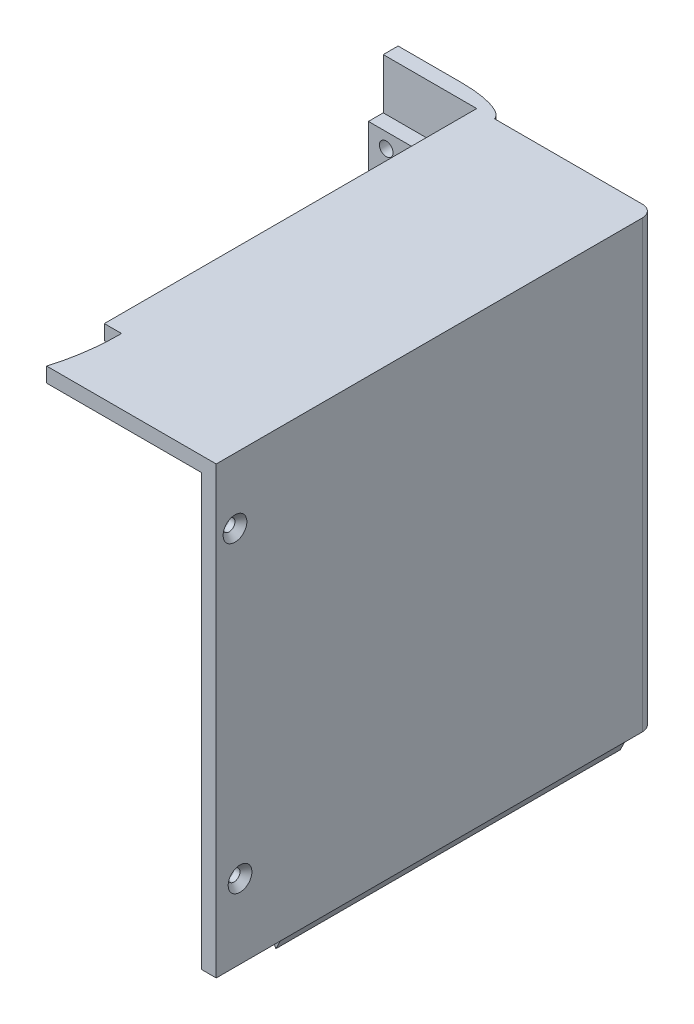
ISO-10303-21;
HEADER;
FILE_DESCRIPTION(('STEP AP214'),'2;1');
FILE_NAME('part.step','',(''),(''),'','','');
FILE_SCHEMA(('AUTOMOTIVE_DESIGN { 1 0 10303 214 1 1 1 1 }'));
ENDSEC;
DATA;
#1=APPLICATION_CONTEXT('core data for automotive mechanical design processes');
#2=APPLICATION_PROTOCOL_DEFINITION('international standard','automotive_design',2000,#1);
#3=PRODUCT_CONTEXT('',#1,'mechanical');
#4=PRODUCT('Part','Part','',(#3));
#5=PRODUCT_RELATED_PRODUCT_CATEGORY('part','',(#4));
#6=PRODUCT_DEFINITION_FORMATION('','',#4);
#7=PRODUCT_DEFINITION_CONTEXT('part definition',#1,'design');
#8=PRODUCT_DEFINITION('design','',#6,#7);
#9=PRODUCT_DEFINITION_SHAPE('','',#8);
#10=(LENGTH_UNIT() NAMED_UNIT(*) SI_UNIT(.MILLI.,.METRE.));
#11=(NAMED_UNIT(*) PLANE_ANGLE_UNIT() SI_UNIT($,.RADIAN.));
#12=(NAMED_UNIT(*) SI_UNIT($,.STERADIAN.) SOLID_ANGLE_UNIT());
#13=UNCERTAINTY_MEASURE_WITH_UNIT(LENGTH_MEASURE(1.E-05),#10,'distance_accuracy_value','');
#14=(GEOMETRIC_REPRESENTATION_CONTEXT(3) GLOBAL_UNCERTAINTY_ASSIGNED_CONTEXT((#13)) GLOBAL_UNIT_ASSIGNED_CONTEXT((#10,
#11,#12)) REPRESENTATION_CONTEXT('',''));
#15=CARTESIAN_POINT('',(0.,0.,0.));
#16=DIRECTION('',(0.,0.,1.));
#17=DIRECTION('',(1.,0.,0.));
#18=AXIS2_PLACEMENT_3D('',#15,#16,#17);
#19=CARTESIAN_POINT('',(0.,75.,-18.3333333333334));
#20=DIRECTION('',(0.,0.,-1.));
#21=DIRECTION('',(-1.,0.,0.));
#22=AXIS2_PLACEMENT_3D('',#19,#20,#21);
#23=PLANE('',#22);
#24=CARTESIAN_POINT('',(-61.9495064540623,11.,-18.3333333333334));
#25=DIRECTION('',(0.,0.,-1.));
#26=DIRECTION('',(-1.,0.,0.));
#27=AXIS2_PLACEMENT_3D('',#24,#25,#26);
#28=CIRCLE('',#27,1.15);
#29=CARTESIAN_POINT('',(-63.0995064540623,11.,-18.3333333333334));
#30=VERTEX_POINT('',#29);
#31=EDGE_CURVE('E490',#30,#30,#28,.T.);
#32=ORIENTED_EDGE('',*,*,#31,.T.);
#33=EDGE_LOOP('',(#32));
#34=FACE_BOUND('',#33,.T.);
#35=CARTESIAN_POINT('',(-61.9495064540623,37.5,-18.3333333333334));
#36=DIRECTION('',(0.,0.,-1.));
#37=DIRECTION('',(-1.,0.,0.));
#38=AXIS2_PLACEMENT_3D('',#35,#36,#37);
#39=CIRCLE('',#38,1.15);
#40=CARTESIAN_POINT('',(-63.0995064540623,37.5,-18.3333333333334));
#41=VERTEX_POINT('',#40);
#42=EDGE_CURVE('E496',#41,#41,#39,.T.);
#43=ORIENTED_EDGE('',*,*,#42,.T.);
#44=EDGE_LOOP('',(#43));
#45=FACE_BOUND('',#44,.T.);
#46=CARTESIAN_POINT('',(-61.9495064540623,64.,-18.3333333333334));
#47=DIRECTION('',(0.,0.,-1.));
#48=DIRECTION('',(-1.,0.,0.));
#49=AXIS2_PLACEMENT_3D('',#46,#47,#48);
#50=CIRCLE('',#49,1.15);
#51=CARTESIAN_POINT('',(-63.0995064540623,64.,-18.3333333333334));
#52=VERTEX_POINT('',#51);
#53=EDGE_CURVE('E499',#52,#52,#50,.T.);
#54=ORIENTED_EDGE('',*,*,#53,.T.);
#55=EDGE_LOOP('',(#54));
#56=FACE_BOUND('',#55,.T.);
#57=DIRECTION('',(0.,-1.,0.));
#58=VECTOR('',#57,1.);
#59=CARTESIAN_POINT('',(-49.1995064540623,0.,-18.3333333333334));
#60=LINE('',#59,#58);
#61=CARTESIAN_POINT('',(-49.1995064540623,72.5,-18.3333333333334));
#62=VERTEX_POINT('',#61);
#63=CARTESIAN_POINT('',(-49.1995064540623,66.5,-18.3333333333334));
#64=VERTEX_POINT('',#63);
#65=EDGE_CURVE('E224',#62,#64,#60,.T.);
#66=ORIENTED_EDGE('',*,*,#65,.T.);
#67=DIRECTION('',(1.,0.,0.));
#68=VECTOR('',#67,1.);
#69=CARTESIAN_POINT('',(0.,66.5,-18.3333333333334));
#70=LINE('',#69,#68);
#71=CARTESIAN_POINT('',(-64.9495064540623,66.5,-18.3333333333334));
#72=VERTEX_POINT('',#71);
#73=EDGE_CURVE('E213',#72,#64,#70,.T.);
#74=ORIENTED_EDGE('',*,*,#73,.F.);
#75=DIRECTION('',(0.,1.,0.));
#76=VECTOR('',#75,1.);
#77=CARTESIAN_POINT('',(-64.9495064540623,75.,-18.3333333333334));
#78=LINE('',#77,#76);
#79=CARTESIAN_POINT('',(-64.9495064540623,0.,-18.3333333333334));
#80=VERTEX_POINT('',#79);
#81=EDGE_CURVE('E503',#80,#72,#78,.T.);
#82=ORIENTED_EDGE('',*,*,#81,.F.);
#83=DIRECTION('',(1.,0.,0.));
#84=VECTOR('',#83,1.);
#85=CARTESIAN_POINT('',(0.,0.,-18.3333333333334));
#86=LINE('',#85,#84);
#87=CARTESIAN_POINT('',(-23.7895064540623,0.,-18.3333333333334));
#88=VERTEX_POINT('',#87);
#89=EDGE_CURVE('E559',#80,#88,#86,.T.);
#90=ORIENTED_EDGE('',*,*,#89,.T.);
#91=DIRECTION('',(0.,-1.,0.));
#92=VECTOR('',#91,1.);
#93=CARTESIAN_POINT('',(-23.7895064540623,75.,-18.3333333333334));
#94=LINE('',#93,#92);
#95=CARTESIAN_POINT('',(-23.7895064540623,72.5,-18.3333333333334));
#96=VERTEX_POINT('',#95);
#97=EDGE_CURVE('E423',#88,#96,#94,.F.);
#98=ORIENTED_EDGE('',*,*,#97,.T.);
#99=DIRECTION('',(1.,0.,0.));
#100=VECTOR('',#99,1.);
#101=CARTESIAN_POINT('',(0.,72.5,-18.3333333333334));
#102=LINE('',#101,#100);
#103=EDGE_CURVE('E433',#62,#96,#102,.T.);
#104=ORIENTED_EDGE('',*,*,#103,.F.);
#105=EDGE_LOOP('',(#66,#74,#82,#90,#98,#104));
#106=FACE_BOUND('',#105,.T.);
#107=ADVANCED_FACE('F54',(#34,#45,#56,#106),#23,.F.);
#108=CARTESIAN_POINT('',(0.,75.,0.));
#109=DIRECTION('',(0.,1.,0.));
#110=DIRECTION('',(0.,0.,1.));
#111=AXIS2_PLACEMENT_3D('',#108,#109,#110);
#112=PLANE('',#111);
#113=DIRECTION('',(1.,0.,0.));
#114=VECTOR('',#113,1.);
#115=CARTESIAN_POINT('',(0.,75.,-20.8333333333334));
#116=LINE('',#115,#114);
#117=CARTESIAN_POINT('',(-46.1995064540623,75.,-20.8333333333334));
#118=VERTEX_POINT('',#117);
#119=CARTESIAN_POINT('',(-21.2895064540623,75.,-20.8333333333334));
#120=VERTEX_POINT('',#119);
#121=EDGE_CURVE('E352',#118,#120,#116,.T.);
#122=ORIENTED_EDGE('',*,*,#121,.F.);
#123=CARTESIAN_POINT('',(-54.3235448586983,75.,-23.3333333333334));
#124=CARTESIAN_POINT('',(-46.9688282726831,75.,-23.3333333333334));
#125=CARTESIAN_POINT('',(-46.1995064540623,75.,-20.8333333333334));
#126=(BOUNDED_CURVE() B_SPLINE_CURVE(2,(#123,#124,#125),.UNSPECIFIED.,.F.,
.F.) B_SPLINE_CURVE_WITH_KNOTS((3,3),(0.,1.),
.UNSPECIFIED.) CURVE() GEOMETRIC_REPRESENTATION_ITEM() RATIONAL_B_SPLINE_CURVE((1.,
0.804399666539844,1.)) REPRESENTATION_ITEM(''));
#127=CARTESIAN_POINT('',(-54.3235448586983,75.,-23.3333333333334));
#128=VERTEX_POINT('',#127);
#129=EDGE_CURVE('E12',#118,#128,#126,.F.);
#130=ORIENTED_EDGE('',*,*,#129,.T.);
#131=DIRECTION('',(1.,0.,0.));
#132=VECTOR('',#131,1.);
#133=CARTESIAN_POINT('',(0.,75.,-23.3333333333334));
#134=LINE('',#133,#132);
#135=CARTESIAN_POINT('',(-64.9495064540623,75.,-23.3333333333334));
#136=VERTEX_POINT('',#135);
#137=EDGE_CURVE('E238',#136,#128,#134,.T.);
#138=ORIENTED_EDGE('',*,*,#137,.F.);
#139=DIRECTION('',(0.,0.,-1.));
#140=VECTOR('',#139,1.);
#141=CARTESIAN_POINT('',(-64.9495064540623,75.,-20.8333333333334));
#142=LINE('',#141,#140);
#143=CARTESIAN_POINT('',(-64.9495064540623,75.,-20.8333333333334));
#144=VERTEX_POINT('',#143);
#145=EDGE_CURVE('E217',#144,#136,#142,.T.);
#146=ORIENTED_EDGE('',*,*,#145,.F.);
#147=DIRECTION('',(-1.,0.,0.));
#148=VECTOR('',#147,1.);
#149=CARTESIAN_POINT('',(0.,75.,-20.8333333333334));
#150=LINE('',#149,#148);
#151=CARTESIAN_POINT('',(-49.1995064540623,75.,-20.8333333333334));
#152=VERTEX_POINT('',#151);
#153=EDGE_CURVE('E209',#152,#144,#150,.T.);
#154=ORIENTED_EDGE('',*,*,#153,.F.);
#155=DIRECTION('',(0.,0.,-1.));
#156=VECTOR('',#155,1.);
#157=CARTESIAN_POINT('',(-49.1995064540623,75.,41.9066666666666));
#158=LINE('',#157,#156);
#159=CARTESIAN_POINT('',(-49.1995064540623,75.,41.9066666666666));
#160=VERTEX_POINT('',#159);
#161=EDGE_CURVE('E193',#160,#152,#158,.T.);
#162=ORIENTED_EDGE('',*,*,#161,.F.);
#163=DIRECTION('',(-1.,0.,0.));
#164=VECTOR('',#163,1.);
#165=CARTESIAN_POINT('',(-46.2995064540623,75.,41.9066666666666));
#166=LINE('',#165,#164);
#167=CARTESIAN_POINT('',(-46.2995064540623,75.,41.9066666666666));
#168=VERTEX_POINT('',#167);
#169=EDGE_CURVE('E204',#168,#160,#166,.T.);
#170=ORIENTED_EDGE('',*,*,#169,.F.);
#171=CARTESIAN_POINT('',(-84.2982149284797,75.,42.2199624952971));
#172=DIRECTION('',(0.,1.,0.));
#173=DIRECTION('',(0.,0.,1.));
#174=AXIS2_PLACEMENT_3D('',#171,#172,#173);
#175=CIRCLE('',#174,38.);
#176=CARTESIAN_POINT('',(-47.8495064540623,75.,52.9666666666666));
#177=VERTEX_POINT('',#176);
#178=EDGE_CURVE('E484',#177,#168,#175,.T.);
#179=ORIENTED_EDGE('',*,*,#178,.F.);
#180=DIRECTION('',(1.,0.,0.));
#181=VECTOR('',#180,1.);
#182=CARTESIAN_POINT('',(0.,75.,52.9666666666666));
#183=LINE('',#182,#181);
#184=CARTESIAN_POINT('',(-19.2895064540623,75.,52.9666666666666));
#185=VERTEX_POINT('',#184);
#186=EDGE_CURVE('E553',#177,#185,#183,.T.);
#187=ORIENTED_EDGE('',*,*,#186,.T.);
#188=DIRECTION('',(0.,0.,1.));
#189=VECTOR('',#188,1.);
#190=CARTESIAN_POINT('',(-19.2895064540623,75.,0.));
#191=LINE('',#190,#189);
#192=CARTESIAN_POINT('',(-19.2895064540623,75.,-18.8333333333334));
#193=VERTEX_POINT('',#192);
#194=EDGE_CURVE('E360',#193,#185,#191,.T.);
#195=ORIENTED_EDGE('',*,*,#194,.F.);
#196=CARTESIAN_POINT('',(-21.2895064540623,75.,-18.8333333333334));
#197=DIRECTION('',(0.,1.,0.));
#198=DIRECTION('',(0.,0.,1.));
#199=AXIS2_PLACEMENT_3D('',#196,#197,#198);
#200=CIRCLE('',#199,2.);
#201=EDGE_CURVE('E404',#193,#120,#200,.T.);
#202=ORIENTED_EDGE('',*,*,#201,.T.);
#203=EDGE_LOOP('',(#122,#130,#138,#146,#154,#162,#170,#179,#187,#195,#202));
#204=FACE_BOUND('',#203,.T.);
#205=ADVANCED_FACE('F216',(#204),#112,.T.);
#206=CARTESIAN_POINT('',(0.,75.,-20.8333333333334));
#207=DIRECTION('',(0.,0.,-1.));
#208=DIRECTION('',(-1.,0.,0.));
#209=AXIS2_PLACEMENT_3D('',#206,#207,#208);
#210=PLANE('',#209);
#211=DIRECTION('',(1.,0.,0.));
#212=VECTOR('',#211,1.);
#213=CARTESIAN_POINT('',(0.,0.,-20.8333333333334));
#214=LINE('',#213,#212);
#215=CARTESIAN_POINT('',(-46.1995064540623,0.,-20.8333333333334));
#216=VERTEX_POINT('',#215);
#217=CARTESIAN_POINT('',(-21.2895064540623,0.,-20.8333333333334));
#218=VERTEX_POINT('',#217);
#219=EDGE_CURVE('E401',#216,#218,#214,.T.);
#220=ORIENTED_EDGE('',*,*,#219,.F.);
#221=CARTESIAN_POINT('',(-46.1995064540623,78.75,-20.8333333333334));
#222=CARTESIAN_POINT('',(-46.1995064540623,51.25,-20.8333333333334));
#223=CARTESIAN_POINT('',(-46.1995064540623,23.75,-20.8333333333334));
#224=CARTESIAN_POINT('',(-46.1995064540623,-3.75,-20.8333333333334));
#225=(BOUNDED_CURVE() B_SPLINE_CURVE(3,(#221,#222,#223,#224),.UNSPECIFIED.,.F.,
.F.) B_SPLINE_CURVE_WITH_KNOTS((4,4),(-0.00375,0.07875),
.UNSPECIFIED.) CURVE() GEOMETRIC_REPRESENTATION_ITEM() RATIONAL_B_SPLINE_CURVE((1.,1.,1.,1.)) REPRESENTATION_ITEM(''));
#226=EDGE_CURVE('E231',#118,#216,#225,.T.);
#227=ORIENTED_EDGE('',*,*,#226,.F.);
#228=ORIENTED_EDGE('',*,*,#121,.T.);
#229=DIRECTION('',(0.,-1.,0.));
#230=VECTOR('',#229,1.);
#231=CARTESIAN_POINT('',(-21.2895064540623,75.,-20.8333333333334));
#232=LINE('',#231,#230);
#233=EDGE_CURVE('E359',#120,#218,#232,.T.);
#234=ORIENTED_EDGE('',*,*,#233,.T.);
#235=EDGE_LOOP('',(#220,#227,#228,#234));
#236=FACE_BOUND('',#235,.T.);
#237=ADVANCED_FACE('F343',(#236),#210,.T.);
#238=CARTESIAN_POINT('',(-21.7895064540623,75.,0.));
#239=DIRECTION('',(1.,0.,0.));
#240=DIRECTION('',(0.,0.,-1.));
#241=AXIS2_PLACEMENT_3D('',#238,#239,#240);
#242=PLANE('',#241);
#243=CARTESIAN_POINT('',(-21.7895064540623,64.,49.8066666666666));
#244=DIRECTION('',(-1.,0.,0.));
#245=DIRECTION('',(0.,0.,1.));
#246=AXIS2_PLACEMENT_3D('',#243,#244,#245);
#247=CIRCLE('',#246,1.15);
#248=CARTESIAN_POINT('',(-21.7895064540623,64.,50.9566666666666));
#249=VERTEX_POINT('',#248);
#250=EDGE_CURVE('E429',#249,#249,#247,.F.);
#251=ORIENTED_EDGE('',*,*,#250,.T.);
#252=EDGE_LOOP('',(#251));
#253=FACE_BOUND('',#252,.T.);
#254=CARTESIAN_POINT('',(-21.7895064540623,12.5,48.9556694539459));
#255=DIRECTION('',(-1.,0.,0.));
#256=DIRECTION('',(0.,0.,1.));
#257=AXIS2_PLACEMENT_3D('',#254,#255,#256);
#258=CIRCLE('',#257,1.15);
#259=CARTESIAN_POINT('',(-21.7895064540623,12.5,50.1056694539459));
#260=VERTEX_POINT('',#259);
#261=EDGE_CURVE('E432',#260,#260,#258,.F.);
#262=ORIENTED_EDGE('',*,*,#261,.T.);
#263=EDGE_LOOP('',(#262));
#264=FACE_BOUND('',#263,.T.);
#265=DIRECTION('',(0.,0.,1.));
#266=VECTOR('',#265,1.);
#267=CARTESIAN_POINT('',(-21.7895064540623,72.5,52.9666666666666));
#268=LINE('',#267,#266);
#269=CARTESIAN_POINT('',(-21.7895064540623,72.5,-16.3333333333334));
#270=VERTEX_POINT('',#269);
#271=CARTESIAN_POINT('',(-21.7895064540623,72.5,52.9666666666666));
#272=VERTEX_POINT('',#271);
#273=EDGE_CURVE('E517',#270,#272,#268,.T.);
#274=ORIENTED_EDGE('',*,*,#273,.F.);
#275=DIRECTION('',(0.,-1.,0.));
#276=VECTOR('',#275,1.);
#277=CARTESIAN_POINT('',(-21.7895064540623,0.,-16.3333333333334));
#278=LINE('',#277,#276);
#279=CARTESIAN_POINT('',(-21.7895064540623,0.,-16.3333333333334));
#280=VERTEX_POINT('',#279);
#281=EDGE_CURVE('E409',#270,#280,#278,.T.);
#282=ORIENTED_EDGE('',*,*,#281,.T.);
#283=DIRECTION('',(0.,0.,1.));
#284=VECTOR('',#283,1.);
#285=CARTESIAN_POINT('',(-21.7895064540623,0.,0.));
#286=LINE('',#285,#284);
#287=CARTESIAN_POINT('',(-21.7895064540623,0.,52.9666666666666));
#288=VERTEX_POINT('',#287);
#289=EDGE_CURVE('E417',#280,#288,#286,.T.);
#290=ORIENTED_EDGE('',*,*,#289,.T.);
#291=DIRECTION('',(0.,1.,0.));
#292=VECTOR('',#291,1.);
#293=CARTESIAN_POINT('',(-21.7895064540623,75.,52.9666666666666));
#294=LINE('',#293,#292);
#295=EDGE_CURVE('E525',#288,#272,#294,.T.);
#296=ORIENTED_EDGE('',*,*,#295,.T.);
#297=EDGE_LOOP('',(#274,#282,#290,#296));
#298=FACE_BOUND('',#297,.T.);
#299=ADVANCED_FACE('F577',(#253,#264,#298),#242,.F.);
#300=CARTESIAN_POINT('',(-23.7895064540623,75.,-16.3333333333334));
#301=DIRECTION('',(0.,1.,0.));
#302=DIRECTION('',(0.,0.,1.));
#303=AXIS2_PLACEMENT_3D('',#300,#301,#302);
#304=CYLINDRICAL_SURFACE('',#303,2.);
#305=CARTESIAN_POINT('',(-23.7895064540623,72.5,-16.3333333333334));
#306=DIRECTION('',(0.,1.,0.));
#307=DIRECTION('',(0.,0.,1.));
#308=AXIS2_PLACEMENT_3D('',#305,#306,#307);
#309=CIRCLE('',#308,2.);
#310=EDGE_CURVE('E428',#96,#270,#309,.F.);
#311=ORIENTED_EDGE('',*,*,#310,.F.);
#312=ORIENTED_EDGE('',*,*,#97,.F.);
#313=CARTESIAN_POINT('',(-23.7895064540623,0.,-16.3333333333334));
#314=DIRECTION('',(0.,1.,0.));
#315=DIRECTION('',(0.,0.,1.));
#316=AXIS2_PLACEMENT_3D('',#313,#314,#315);
#317=CIRCLE('',#316,2.);
#318=EDGE_CURVE('E426',#280,#88,#317,.T.);
#319=ORIENTED_EDGE('',*,*,#318,.F.);
#320=ORIENTED_EDGE('',*,*,#281,.F.);
#321=EDGE_LOOP('',(#311,#312,#319,#320));
#322=FACE_BOUND('',#321,.T.);
#323=ADVANCED_FACE('F592',(#322),#304,.F.);
#324=CARTESIAN_POINT('',(0.,0.,0.));
#325=DIRECTION('',(0.,1.,0.));
#326=DIRECTION('',(0.,0.,1.));
#327=AXIS2_PLACEMENT_3D('',#324,#325,#326);
#328=PLANE('',#327);
#329=DIRECTION('',(1.,0.,0.));
#330=VECTOR('',#329,1.);
#331=CARTESIAN_POINT('',(-21.5395064540623,0.,41.6666666666666));
#332=LINE('',#331,#330);
#333=CARTESIAN_POINT('',(-21.5395064540623,0.,41.6666666666666));
#334=VERTEX_POINT('',#333);
#335=CARTESIAN_POINT('',(-19.5395064540623,0.,41.6666666666666));
#336=VERTEX_POINT('',#335);
#337=EDGE_CURVE('E548',#334,#336,#332,.T.);
#338=ORIENTED_EDGE('',*,*,#337,.T.);
#339=DIRECTION('',(0.,0.,-1.));
#340=VECTOR('',#339,1.);
#341=CARTESIAN_POINT('',(-19.5395064540623,0.,41.6666666666666));
#342=LINE('',#341,#340);
#343=CARTESIAN_POINT('',(-19.5395064540623,0.,-16.3333333333334));
#344=VERTEX_POINT('',#343);
#345=EDGE_CURVE('E533',#336,#344,#342,.T.);
#346=ORIENTED_EDGE('',*,*,#345,.T.);
#347=DIRECTION('',(1.,0.,0.));
#348=VECTOR('',#347,1.);
#349=CARTESIAN_POINT('',(-21.5395064540623,0.,-16.3333333333334));
#350=LINE('',#349,#348);
#351=CARTESIAN_POINT('',(-21.5395064540623,0.,-16.3333333333334));
#352=VERTEX_POINT('',#351);
#353=EDGE_CURVE('E540',#352,#344,#350,.T.);
#354=ORIENTED_EDGE('',*,*,#353,.F.);
#355=DIRECTION('',(0.,0.,-1.));
#356=VECTOR('',#355,1.);
#357=CARTESIAN_POINT('',(-21.5395064540623,0.,41.6666666666666));
#358=LINE('',#357,#356);
#359=EDGE_CURVE('E529',#334,#352,#358,.T.);
#360=ORIENTED_EDGE('',*,*,#359,.F.);
#361=EDGE_LOOP('',(#338,#346,#354,#360));
#362=FACE_BOUND('',#361,.T.);
#363=DIRECTION('',(-1.,0.,0.));
#364=VECTOR('',#363,1.);
#365=CARTESIAN_POINT('',(0.,0.,-23.3333333333334));
#366=LINE('',#365,#364);
#367=CARTESIAN_POINT('',(-54.3235448586983,0.,-23.3333333333334));
#368=VERTEX_POINT('',#367);
#369=CARTESIAN_POINT('',(-64.9495064540623,0.,-23.3333333333334));
#370=VERTEX_POINT('',#369);
#371=EDGE_CURVE('E241',#368,#370,#366,.T.);
#372=ORIENTED_EDGE('',*,*,#371,.F.);
#373=CARTESIAN_POINT('',(-46.1995064540623,0.,-20.8333333333334));
#374=CARTESIAN_POINT('',(-46.9688282726832,0.,-23.3333333333334));
#375=CARTESIAN_POINT('',(-54.3235448586983,0.,-23.3333333333334));
#376=(BOUNDED_CURVE() B_SPLINE_CURVE(2,(#373,#374,#375),.UNSPECIFIED.,.F.,
.F.) B_SPLINE_CURVE_WITH_KNOTS((3,3),(0.,1.),
.UNSPECIFIED.) CURVE() GEOMETRIC_REPRESENTATION_ITEM() RATIONAL_B_SPLINE_CURVE((1.,
0.804399666539844,1.)) REPRESENTATION_ITEM(''));
#377=EDGE_CURVE('E69',#368,#216,#376,.F.);
#378=ORIENTED_EDGE('',*,*,#377,.T.);
#379=ORIENTED_EDGE('',*,*,#219,.T.);
#380=CARTESIAN_POINT('',(-21.2895064540623,0.,-18.8333333333334));
#381=DIRECTION('',(0.,1.,0.));
#382=DIRECTION('',(0.,0.,1.));
#383=AXIS2_PLACEMENT_3D('',#380,#381,#382);
#384=CIRCLE('',#383,2.);
#385=CARTESIAN_POINT('',(-19.2895064540623,0.,-18.8333333333334));
#386=VERTEX_POINT('',#385);
#387=EDGE_CURVE('E413',#218,#386,#384,.F.);
#388=ORIENTED_EDGE('',*,*,#387,.T.);
#389=DIRECTION('',(0.,0.,1.));
#390=VECTOR('',#389,1.);
#391=CARTESIAN_POINT('',(-19.2895064540623,0.,0.));
#392=LINE('',#391,#390);
#393=CARTESIAN_POINT('',(-19.2895064540623,0.,52.9666666666666));
#394=VERTEX_POINT('',#393);
#395=EDGE_CURVE('E557',#386,#394,#392,.T.);
#396=ORIENTED_EDGE('',*,*,#395,.T.);
#397=DIRECTION('',(1.,0.,0.));
#398=VECTOR('',#397,1.);
#399=CARTESIAN_POINT('',(0.,0.,52.9666666666666));
#400=LINE('',#399,#398);
#401=EDGE_CURVE('E545',#288,#394,#400,.T.);
#402=ORIENTED_EDGE('',*,*,#401,.F.);
#403=ORIENTED_EDGE('',*,*,#289,.F.);
#404=ORIENTED_EDGE('',*,*,#318,.T.);
#405=ORIENTED_EDGE('',*,*,#89,.F.);
#406=DIRECTION('',(0.,0.,1.));
#407=VECTOR('',#406,1.);
#408=CARTESIAN_POINT('',(-64.9495064540623,0.,-20.8333333333334));
#409=LINE('',#408,#407);
#410=EDGE_CURVE('E481',#370,#80,#409,.T.);
#411=ORIENTED_EDGE('',*,*,#410,.F.);
#412=EDGE_LOOP('',(#372,#378,#379,#388,#396,#402,#403,#404,#405,#411));
#413=FACE_BOUND('',#412,.T.);
#414=ADVANCED_FACE('F344',(#362,#413),#328,.F.);
#415=CARTESIAN_POINT('',(0.,75.,52.9666666666666));
#416=DIRECTION('',(0.,0.,-1.));
#417=DIRECTION('',(-1.,0.,0.));
#418=AXIS2_PLACEMENT_3D('',#415,#416,#417);
#419=PLANE('',#418);
#420=ORIENTED_EDGE('',*,*,#186,.F.);
#421=DIRECTION('',(0.,1.,0.));
#422=VECTOR('',#421,1.);
#423=CARTESIAN_POINT('',(-47.8495064540623,65.,52.9666666666666));
#424=LINE('',#423,#422);
#425=CARTESIAN_POINT('',(-47.8495064540623,72.5,52.9666666666666));
#426=VERTEX_POINT('',#425);
#427=EDGE_CURVE('E203',#426,#177,#424,.T.);
#428=ORIENTED_EDGE('',*,*,#427,.F.);
#429=DIRECTION('',(1.,0.,0.));
#430=VECTOR('',#429,1.);
#431=CARTESIAN_POINT('',(-41.7895064540623,72.5,52.9666666666666));
#432=LINE('',#431,#430);
#433=EDGE_CURVE('E520',#426,#272,#432,.T.);
#434=ORIENTED_EDGE('',*,*,#433,.T.);
#435=ORIENTED_EDGE('',*,*,#295,.F.);
#436=ORIENTED_EDGE('',*,*,#401,.T.);
#437=DIRECTION('',(0.,-1.,0.));
#438=VECTOR('',#437,1.);
#439=CARTESIAN_POINT('',(-19.2895064540623,75.,52.9666666666666));
#440=LINE('',#439,#438);
#441=EDGE_CURVE('E441',#185,#394,#440,.T.);
#442=ORIENTED_EDGE('',*,*,#441,.F.);
#443=EDGE_LOOP('',(#420,#428,#434,#435,#436,#442));
#444=FACE_BOUND('',#443,.T.);
#445=ADVANCED_FACE('F338',(#444),#419,.F.);
#446=CARTESIAN_POINT('',(-24.2895064540623,12.5,48.9556694539459));
#447=DIRECTION('',(1.,0.,0.));
#448=DIRECTION('',(0.,0.,-1.));
#449=AXIS2_PLACEMENT_3D('',#446,#447,#448);
#450=CYLINDRICAL_SURFACE('',#449,1.15);
#451=CARTESIAN_POINT('',(-21.2895064540623,12.5,48.9556694539459));
#452=DIRECTION('',(-1.,0.,0.));
#453=DIRECTION('',(0.,0.,1.));
#454=AXIS2_PLACEMENT_3D('',#451,#452,#453);
#455=CIRCLE('',#454,1.15);
#456=CARTESIAN_POINT('',(-21.2895064540623,12.5,50.1056694539459));
#457=VERTEX_POINT('',#456);
#458=EDGE_CURVE('E440',#457,#457,#455,.F.);
#459=ORIENTED_EDGE('',*,*,#458,.T.);
#460=EDGE_LOOP('',(#459));
#461=FACE_BOUND('',#460,.T.);
#462=ORIENTED_EDGE('',*,*,#261,.F.);
#463=EDGE_LOOP('',(#462));
#464=FACE_BOUND('',#463,.T.);
#465=ADVANCED_FACE('F334',(#461,#464),#450,.F.);
#466=CARTESIAN_POINT('',(-24.2895064540623,64.,49.8066666666666));
#467=DIRECTION('',(1.,0.,0.));
#468=DIRECTION('',(0.,0.,-1.));
#469=AXIS2_PLACEMENT_3D('',#466,#467,#468);
#470=CYLINDRICAL_SURFACE('',#469,1.15);
#471=CARTESIAN_POINT('',(-21.2895064540623,64.,49.8066666666666));
#472=DIRECTION('',(-1.,0.,0.));
#473=DIRECTION('',(0.,0.,1.));
#474=AXIS2_PLACEMENT_3D('',#471,#472,#473);
#475=CIRCLE('',#474,1.15);
#476=CARTESIAN_POINT('',(-21.2895064540623,64.,50.9566666666666));
#477=VERTEX_POINT('',#476);
#478=EDGE_CURVE('E437',#477,#477,#475,.F.);
#479=ORIENTED_EDGE('',*,*,#478,.T.);
#480=EDGE_LOOP('',(#479));
#481=FACE_BOUND('',#480,.T.);
#482=ORIENTED_EDGE('',*,*,#250,.F.);
#483=EDGE_LOOP('',(#482));
#484=FACE_BOUND('',#483,.T.);
#485=ADVANCED_FACE('F330',(#481,#484),#470,.F.);
#486=CARTESIAN_POINT('',(-19.2895064540623,75.,0.));
#487=DIRECTION('',(1.,0.,0.));
#488=DIRECTION('',(0.,0.,-1.));
#489=AXIS2_PLACEMENT_3D('',#486,#487,#488);
#490=PLANE('',#489);
#491=CARTESIAN_POINT('',(-19.2895064540623,12.5,48.9556694539459));
#492=DIRECTION('',(1.,0.,0.));
#493=DIRECTION('',(0.,0.,-1.));
#494=AXIS2_PLACEMENT_3D('',#491,#492,#493);
#495=CIRCLE('',#494,1.99762977970872);
#496=CARTESIAN_POINT('',(-19.2895064540623,12.5,46.9580396742372));
#497=VERTEX_POINT('',#496);
#498=EDGE_CURVE('E447',#497,#497,#495,.F.);
#499=ORIENTED_EDGE('',*,*,#498,.T.);
#500=EDGE_LOOP('',(#499));
#501=FACE_BOUND('',#500,.T.);
#502=CARTESIAN_POINT('',(-19.2895064540623,64.,49.8066666666666));
#503=DIRECTION('',(1.,0.,0.));
#504=DIRECTION('',(0.,0.,-1.));
#505=AXIS2_PLACEMENT_3D('',#502,#503,#504);
#506=CIRCLE('',#505,2.00000000000002);
#507=CARTESIAN_POINT('',(-19.2895064540623,64.,47.8066666666666));
#508=VERTEX_POINT('',#507);
#509=EDGE_CURVE('E444',#508,#508,#506,.F.);
#510=ORIENTED_EDGE('',*,*,#509,.T.);
#511=EDGE_LOOP('',(#510));
#512=FACE_BOUND('',#511,.T.);
#513=ORIENTED_EDGE('',*,*,#395,.F.);
#514=DIRECTION('',(0.,-1.,0.));
#515=VECTOR('',#514,1.);
#516=CARTESIAN_POINT('',(-19.2895064540623,75.,-18.8333333333334));
#517=LINE('',#516,#515);
#518=EDGE_CURVE('E410',#386,#193,#517,.F.);
#519=ORIENTED_EDGE('',*,*,#518,.T.);
#520=ORIENTED_EDGE('',*,*,#194,.T.);
#521=ORIENTED_EDGE('',*,*,#441,.T.);
#522=EDGE_LOOP('',(#513,#519,#520,#521));
#523=FACE_BOUND('',#522,.T.);
#524=ADVANCED_FACE('F333',(#501,#512,#523),#490,.T.);
#525=CARTESIAN_POINT('',(-21.2895064540623,75.,-18.8333333333334));
#526=DIRECTION('',(0.,-1.,0.));
#527=DIRECTION('',(0.,0.,-1.));
#528=AXIS2_PLACEMENT_3D('',#525,#526,#527);
#529=CYLINDRICAL_SURFACE('',#528,2.);
#530=ORIENTED_EDGE('',*,*,#201,.F.);
#531=ORIENTED_EDGE('',*,*,#518,.F.);
#532=ORIENTED_EDGE('',*,*,#387,.F.);
#533=ORIENTED_EDGE('',*,*,#233,.F.);
#534=EDGE_LOOP('',(#530,#531,#532,#533));
#535=FACE_BOUND('',#534,.T.);
#536=ADVANCED_FACE('F318',(#535),#529,.T.);
#537=CARTESIAN_POINT('',(-20.5395064540623,-2.,41.6666666666666));
#538=DIRECTION('',(-0.894427190999916,-0.447213595499958,0.));
#539=DIRECTION('',(0.447213595499958,-0.894427190999916,0.));
#540=AXIS2_PLACEMENT_3D('',#537,#538,#539);
#541=PLANE('',#540);
#542=DIRECTION('',(-0.447213595499958,0.894427190999916,0.));
#543=VECTOR('',#542,1.);
#544=CARTESIAN_POINT('',(-20.5395064540623,-2.,-16.3333333333334));
#545=LINE('',#544,#543);
#546=CARTESIAN_POINT('',(-20.5395064540623,-2.,-16.3333333333334));
#547=VERTEX_POINT('',#546);
#548=EDGE_CURVE('E543',#547,#352,#545,.T.);
#549=ORIENTED_EDGE('',*,*,#548,.F.);
#550=DIRECTION('',(0.,0.,-1.));
#551=VECTOR('',#550,1.);
#552=CARTESIAN_POINT('',(-20.5395064540623,-2.,41.6666666666666));
#553=LINE('',#552,#551);
#554=CARTESIAN_POINT('',(-20.5395064540623,-2.,41.6666666666666));
#555=VERTEX_POINT('',#554);
#556=EDGE_CURVE('E528',#555,#547,#553,.T.);
#557=ORIENTED_EDGE('',*,*,#556,.F.);
#558=DIRECTION('',(-0.447213595499958,0.894427190999916,0.));
#559=VECTOR('',#558,1.);
#560=CARTESIAN_POINT('',(-20.5395064540623,-2.,41.6666666666666));
#561=LINE('',#560,#559);
#562=EDGE_CURVE('E541',#555,#334,#561,.T.);
#563=ORIENTED_EDGE('',*,*,#562,.T.);
#564=ORIENTED_EDGE('',*,*,#359,.T.);
#565=EDGE_LOOP('',(#549,#557,#563,#564));
#566=FACE_BOUND('',#565,.T.);
#567=ADVANCED_FACE('F314',(#566),#541,.T.);
#568=CARTESIAN_POINT('',(-19.5395064540623,0.,41.6666666666666));
#569=DIRECTION('',(0.894427190999916,-0.447213595499958,0.));
#570=DIRECTION('',(0.447213595499958,0.894427190999916,0.));
#571=AXIS2_PLACEMENT_3D('',#568,#569,#570);
#572=PLANE('',#571);
#573=DIRECTION('',(-0.447213595499958,-0.894427190999916,0.));
#574=VECTOR('',#573,1.);
#575=CARTESIAN_POINT('',(-19.5395064540623,0.,-16.3333333333334));
#576=LINE('',#575,#574);
#577=EDGE_CURVE('E537',#344,#547,#576,.T.);
#578=ORIENTED_EDGE('',*,*,#577,.F.);
#579=ORIENTED_EDGE('',*,*,#345,.F.);
#580=DIRECTION('',(-0.447213595499958,-0.894427190999916,0.));
#581=VECTOR('',#580,1.);
#582=CARTESIAN_POINT('',(-19.5395064540623,0.,41.6666666666666));
#583=LINE('',#582,#581);
#584=EDGE_CURVE('E532',#336,#555,#583,.T.);
#585=ORIENTED_EDGE('',*,*,#584,.T.);
#586=ORIENTED_EDGE('',*,*,#556,.T.);
#587=EDGE_LOOP('',(#578,#579,#585,#586));
#588=FACE_BOUND('',#587,.T.);
#589=ADVANCED_FACE('F317',(#588),#572,.T.);
#590=CARTESIAN_POINT('',(0.,0.,41.6666666666666));
#591=DIRECTION('',(0.,0.,-1.));
#592=DIRECTION('',(-1.,0.,0.));
#593=AXIS2_PLACEMENT_3D('',#590,#591,#592);
#594=PLANE('',#593);
#595=ORIENTED_EDGE('',*,*,#562,.F.);
#596=ORIENTED_EDGE('',*,*,#584,.F.);
#597=ORIENTED_EDGE('',*,*,#337,.F.);
#598=EDGE_LOOP('',(#595,#596,#597));
#599=FACE_BOUND('',#598,.T.);
#600=ADVANCED_FACE('F322',(#599),#594,.F.);
#601=CARTESIAN_POINT('',(0.,0.,-16.3333333333334));
#602=DIRECTION('',(0.,0.,-1.));
#603=DIRECTION('',(-1.,0.,0.));
#604=AXIS2_PLACEMENT_3D('',#601,#602,#603);
#605=PLANE('',#604);
#606=ORIENTED_EDGE('',*,*,#548,.T.);
#607=ORIENTED_EDGE('',*,*,#353,.T.);
#608=ORIENTED_EDGE('',*,*,#577,.T.);
#609=EDGE_LOOP('',(#606,#607,#608));
#610=FACE_BOUND('',#609,.T.);
#611=ADVANCED_FACE('F312',(#610),#605,.T.);
#612=CARTESIAN_POINT('',(-41.7895064540623,72.5,52.9666666666666));
#613=DIRECTION('',(0.,1.,0.));
#614=DIRECTION('',(0.,0.,1.));
#615=AXIS2_PLACEMENT_3D('',#612,#613,#614);
#616=PLANE('',#615);
#617=DIRECTION('',(-1.,0.,0.));
#618=VECTOR('',#617,1.);
#619=CARTESIAN_POINT('',(-41.7895064540623,72.5,41.9066666666666));
#620=LINE('',#619,#618);
#621=CARTESIAN_POINT('',(-46.2995064540623,72.5,41.9066666666666));
#622=VERTEX_POINT('',#621);
#623=CARTESIAN_POINT('',(-49.1995064540623,72.5,41.9066666666666));
#624=VERTEX_POINT('',#623);
#625=EDGE_CURVE('E456',#622,#624,#620,.T.);
#626=ORIENTED_EDGE('',*,*,#625,.T.);
#627=DIRECTION('',(0.,0.,-1.));
#628=VECTOR('',#627,1.);
#629=CARTESIAN_POINT('',(-49.1995064540623,72.5,52.9666666666666));
#630=LINE('',#629,#628);
#631=EDGE_CURVE('E459',#624,#62,#630,.T.);
#632=ORIENTED_EDGE('',*,*,#631,.T.);
#633=ORIENTED_EDGE('',*,*,#103,.T.);
#634=ORIENTED_EDGE('',*,*,#310,.T.);
#635=ORIENTED_EDGE('',*,*,#273,.T.);
#636=ORIENTED_EDGE('',*,*,#433,.F.);
#637=CARTESIAN_POINT('',(-84.2982149284797,72.5,42.2199624952971));
#638=DIRECTION('',(0.,1.,0.));
#639=DIRECTION('',(0.,0.,1.));
#640=AXIS2_PLACEMENT_3D('',#637,#638,#639);
#641=CIRCLE('',#640,38.);
#642=EDGE_CURVE('E453',#426,#622,#641,.T.);
#643=ORIENTED_EDGE('',*,*,#642,.T.);
#644=EDGE_LOOP('',(#626,#632,#633,#634,#635,#636,#643));
#645=FACE_BOUND('',#644,.T.);
#646=ADVANCED_FACE('F309',(#645),#616,.F.);
#647=CARTESIAN_POINT('',(-21.2895064540623,0.,0.));
#648=DIRECTION('',(-1.,0.,0.));
#649=DIRECTION('',(0.,0.,1.));
#650=AXIS2_PLACEMENT_3D('',#647,#648,#649);
#651=PLANE('',#650);
#652=CARTESIAN_POINT('',(-21.2895064540623,64.,49.8066666666666));
#653=DIRECTION('',(-1.,0.,0.));
#654=DIRECTION('',(0.,0.,1.));
#655=AXIS2_PLACEMENT_3D('',#652,#653,#654);
#656=CIRCLE('',#655,0.999999999999998);
#657=CARTESIAN_POINT('',(-21.2895064540623,64.,50.8066666666666));
#658=VERTEX_POINT('',#657);
#659=EDGE_CURVE('E508',#658,#658,#656,.T.);
#660=ORIENTED_EDGE('',*,*,#659,.F.);
#661=EDGE_LOOP('',(#660));
#662=FACE_BOUND('',#661,.T.);
#663=ORIENTED_EDGE('',*,*,#478,.F.);
#664=EDGE_LOOP('',(#663));
#665=FACE_BOUND('',#664,.T.);
#666=ADVANCED_FACE('F307',(#662,#665),#651,.T.);
#667=CARTESIAN_POINT('',(-21.2895064540623,12.5,48.9556694539459));
#668=DIRECTION('',(-1.,0.,0.));
#669=DIRECTION('',(0.,0.,1.));
#670=AXIS2_PLACEMENT_3D('',#667,#668,#669);
#671=CIRCLE('',#670,0.997629779708702);
#672=CARTESIAN_POINT('',(-21.2895064540623,12.5,49.9532992336546));
#673=VERTEX_POINT('',#672);
#674=EDGE_CURVE('E507',#673,#673,#671,.T.);
#675=ORIENTED_EDGE('',*,*,#674,.F.);
#676=EDGE_LOOP('',(#675));
#677=FACE_BOUND('',#676,.T.);
#678=ORIENTED_EDGE('',*,*,#458,.F.);
#679=EDGE_LOOP('',(#678));
#680=FACE_BOUND('',#679,.T.);
#681=ADVANCED_FACE('F303',(#677,#680),#651,.T.);
#682=CARTESIAN_POINT('',(-11.2895064540623,12.5,48.9556694539459));
#683=DIRECTION('',(-1.,0.,0.));
#684=DIRECTION('',(0.,0.,1.));
#685=AXIS2_PLACEMENT_3D('',#682,#683,#684);
#686=CYLINDRICAL_SURFACE('',#685,0.997629779708702);
#687=CARTESIAN_POINT('',(-20.2895064540623,12.5,48.9556694539459));
#688=DIRECTION('',(1.,0.,0.));
#689=DIRECTION('',(0.,0.,-1.));
#690=AXIS2_PLACEMENT_3D('',#687,#688,#689);
#691=CIRCLE('',#690,0.997629779708702);
#692=CARTESIAN_POINT('',(-20.2895064540623,12.5,47.9580396742372));
#693=VERTEX_POINT('',#692);
#694=EDGE_CURVE('E436',#693,#693,#691,.T.);
#695=ORIENTED_EDGE('',*,*,#694,.T.);
#696=EDGE_LOOP('',(#695));
#697=FACE_BOUND('',#696,.T.);
#698=ORIENTED_EDGE('',*,*,#674,.T.);
#699=EDGE_LOOP('',(#698));
#700=FACE_BOUND('',#699,.T.);
#701=ADVANCED_FACE('F299',(#697,#700),#686,.F.);
#702=CARTESIAN_POINT('',(-11.2895064540623,64.,49.8066666666666));
#703=DIRECTION('',(-1.,0.,0.));
#704=DIRECTION('',(0.,0.,1.));
#705=AXIS2_PLACEMENT_3D('',#702,#703,#704);
#706=CYLINDRICAL_SURFACE('',#705,0.999999999999998);
#707=CARTESIAN_POINT('',(-20.2895064540623,64.,49.8066666666666));
#708=DIRECTION('',(1.,0.,0.));
#709=DIRECTION('',(0.,0.,-1.));
#710=AXIS2_PLACEMENT_3D('',#707,#708,#709);
#711=CIRCLE('',#710,0.999999999999998);
#712=CARTESIAN_POINT('',(-20.2895064540623,64.,48.8066666666666));
#713=VERTEX_POINT('',#712);
#714=EDGE_CURVE('E450',#713,#713,#711,.T.);
#715=ORIENTED_EDGE('',*,*,#714,.T.);
#716=EDGE_LOOP('',(#715));
#717=FACE_BOUND('',#716,.T.);
#718=ORIENTED_EDGE('',*,*,#659,.T.);
#719=EDGE_LOOP('',(#718));
#720=FACE_BOUND('',#719,.T.);
#721=ADVANCED_FACE('F295',(#717,#720),#706,.F.);
#722=CARTESIAN_POINT('',(-20.2895064540623,12.5,48.9556694539459));
#723=DIRECTION('',(1.,0.,0.));
#724=DIRECTION('',(0.,0.,-1.));
#725=AXIS2_PLACEMENT_3D('',#722,#723,#724);
#726=CONICAL_SURFACE('',#725,0.997629779708702,0.785398163397457);
#727=ORIENTED_EDGE('',*,*,#498,.F.);
#728=EDGE_LOOP('',(#727));
#729=FACE_BOUND('',#728,.T.);
#730=ORIENTED_EDGE('',*,*,#694,.F.);
#731=EDGE_LOOP('',(#730));
#732=FACE_BOUND('',#731,.T.);
#733=ADVANCED_FACE('F298',(#729,#732),#726,.F.);
#734=CARTESIAN_POINT('',(-20.2895064540623,64.,49.8066666666666));
#735=DIRECTION('',(1.,0.,0.));
#736=DIRECTION('',(0.,0.,-1.));
#737=AXIS2_PLACEMENT_3D('',#734,#735,#736);
#738=CONICAL_SURFACE('',#737,0.999999999999998,0.785398163397445);
#739=ORIENTED_EDGE('',*,*,#509,.F.);
#740=EDGE_LOOP('',(#739));
#741=FACE_BOUND('',#740,.T.);
#742=ORIENTED_EDGE('',*,*,#714,.F.);
#743=EDGE_LOOP('',(#742));
#744=FACE_BOUND('',#743,.T.);
#745=ADVANCED_FACE('F293',(#741,#744),#738,.F.);
#746=CARTESIAN_POINT('',(-64.9495064540623,0.,0.));
#747=DIRECTION('',(-1.,0.,0.));
#748=DIRECTION('',(0.,0.,1.));
#749=AXIS2_PLACEMENT_3D('',#746,#747,#748);
#750=PLANE('',#749);
#751=DIRECTION('',(0.,0.,1.));
#752=VECTOR('',#751,1.);
#753=CARTESIAN_POINT('',(-64.9495064540623,66.5,-20.8333333333334));
#754=LINE('',#753,#752);
#755=CARTESIAN_POINT('',(-64.9495064540623,66.5,-20.8333333333334));
#756=VERTEX_POINT('',#755);
#757=EDGE_CURVE('E223',#756,#72,#754,.T.);
#758=ORIENTED_EDGE('',*,*,#757,.F.);
#759=DIRECTION('',(0.,-1.,0.));
#760=VECTOR('',#759,1.);
#761=CARTESIAN_POINT('',(-64.9495064540623,0.,-20.8333333333334));
#762=LINE('',#761,#760);
#763=EDGE_CURVE('E218',#144,#756,#762,.T.);
#764=ORIENTED_EDGE('',*,*,#763,.F.);
#765=ORIENTED_EDGE('',*,*,#145,.T.);
#766=DIRECTION('',(0.,1.,0.));
#767=VECTOR('',#766,1.);
#768=CARTESIAN_POINT('',(-64.9495064540623,0.,-23.3333333333334));
#769=LINE('',#768,#767);
#770=EDGE_CURVE('E245',#370,#136,#769,.T.);
#771=ORIENTED_EDGE('',*,*,#770,.F.);
#772=ORIENTED_EDGE('',*,*,#410,.T.);
#773=ORIENTED_EDGE('',*,*,#81,.T.);
#774=EDGE_LOOP('',(#758,#764,#765,#771,#772,#773));
#775=FACE_BOUND('',#774,.T.);
#776=ADVANCED_FACE('F289',(#775),#750,.T.);
#777=CARTESIAN_POINT('',(-61.9495064540623,11.,-16.8333333333334));
#778=DIRECTION('',(0.,0.,-1.));
#779=DIRECTION('',(-1.,0.,0.));
#780=AXIS2_PLACEMENT_3D('',#777,#778,#779);
#781=CYLINDRICAL_SURFACE('',#780,1.15);
#782=CARTESIAN_POINT('',(-61.9495064540623,11.,-22.3333333333333));
#783=DIRECTION('',(0.,0.,-1.));
#784=DIRECTION('',(-1.,0.,0.));
#785=AXIS2_PLACEMENT_3D('',#782,#783,#784);
#786=CIRCLE('',#785,1.15);
#787=CARTESIAN_POINT('',(-63.0995064540623,11.,-22.3333333333333));
#788=VERTEX_POINT('',#787);
#789=EDGE_CURVE('E471',#788,#788,#786,.T.);
#790=ORIENTED_EDGE('',*,*,#789,.T.);
#791=EDGE_LOOP('',(#790));
#792=FACE_BOUND('',#791,.T.);
#793=ORIENTED_EDGE('',*,*,#31,.F.);
#794=EDGE_LOOP('',(#793));
#795=FACE_BOUND('',#794,.T.);
#796=ADVANCED_FACE('F285',(#792,#795),#781,.F.);
#797=CARTESIAN_POINT('',(-61.9495064540623,37.5,-16.8333333333334));
#798=DIRECTION('',(0.,0.,-1.));
#799=DIRECTION('',(-1.,0.,0.));
#800=AXIS2_PLACEMENT_3D('',#797,#798,#799);
#801=CYLINDRICAL_SURFACE('',#800,1.15);
#802=CARTESIAN_POINT('',(-61.9495064540623,37.5,-22.3333333333333));
#803=DIRECTION('',(0.,0.,-1.));
#804=DIRECTION('',(-1.,0.,0.));
#805=AXIS2_PLACEMENT_3D('',#802,#803,#804);
#806=CIRCLE('',#805,1.15);
#807=CARTESIAN_POINT('',(-63.0995064540623,37.5,-22.3333333333333));
#808=VERTEX_POINT('',#807);
#809=EDGE_CURVE('E473',#808,#808,#806,.T.);
#810=ORIENTED_EDGE('',*,*,#809,.T.);
#811=EDGE_LOOP('',(#810));
#812=FACE_BOUND('',#811,.T.);
#813=ORIENTED_EDGE('',*,*,#42,.F.);
#814=EDGE_LOOP('',(#813));
#815=FACE_BOUND('',#814,.T.);
#816=ADVANCED_FACE('F281',(#812,#815),#801,.F.);
#817=CARTESIAN_POINT('',(-61.9495064540623,64.,-16.8333333333334));
#818=DIRECTION('',(0.,0.,-1.));
#819=DIRECTION('',(-1.,0.,0.));
#820=AXIS2_PLACEMENT_3D('',#817,#818,#819);
#821=CYLINDRICAL_SURFACE('',#820,1.15);
#822=CARTESIAN_POINT('',(-61.9495064540623,64.,-22.3333333333333));
#823=DIRECTION('',(0.,0.,-1.));
#824=DIRECTION('',(-1.,0.,0.));
#825=AXIS2_PLACEMENT_3D('',#822,#823,#824);
#826=CIRCLE('',#825,1.15);
#827=CARTESIAN_POINT('',(-63.0995064540623,64.,-22.3333333333333));
#828=VERTEX_POINT('',#827);
#829=EDGE_CURVE('E242',#828,#828,#826,.T.);
#830=ORIENTED_EDGE('',*,*,#829,.T.);
#831=EDGE_LOOP('',(#830));
#832=FACE_BOUND('',#831,.T.);
#833=ORIENTED_EDGE('',*,*,#53,.F.);
#834=EDGE_LOOP('',(#833));
#835=FACE_BOUND('',#834,.T.);
#836=ADVANCED_FACE('F272',(#832,#835),#821,.F.);
#837=CARTESIAN_POINT('',(-49.1995064540623,65.,41.9066666666666));
#838=DIRECTION('',(1.,0.,0.));
#839=DIRECTION('',(0.,0.,-1.));
#840=AXIS2_PLACEMENT_3D('',#837,#838,#839);
#841=PLANE('',#840);
#842=DIRECTION('',(0.,1.,0.));
#843=VECTOR('',#842,1.);
#844=CARTESIAN_POINT('',(-49.1995064540623,65.,41.9066666666666));
#845=LINE('',#844,#843);
#846=EDGE_CURVE('E199',#624,#160,#845,.T.);
#847=ORIENTED_EDGE('',*,*,#846,.T.);
#848=ORIENTED_EDGE('',*,*,#161,.T.);
#849=DIRECTION('',(0.,-1.,0.));
#850=VECTOR('',#849,1.);
#851=CARTESIAN_POINT('',(-49.1995064540623,0.,-20.8333333333334));
#852=LINE('',#851,#850);
#853=CARTESIAN_POINT('',(-49.1995064540623,66.5,-20.8333333333334));
#854=VERTEX_POINT('',#853);
#855=EDGE_CURVE('E196',#152,#854,#852,.T.);
#856=ORIENTED_EDGE('',*,*,#855,.T.);
#857=DIRECTION('',(0.,0.,1.));
#858=VECTOR('',#857,1.);
#859=CARTESIAN_POINT('',(-49.1995064540623,66.5,-20.8333333333334));
#860=LINE('',#859,#858);
#861=EDGE_CURVE('E229',#854,#64,#860,.T.);
#862=ORIENTED_EDGE('',*,*,#861,.T.);
#863=ORIENTED_EDGE('',*,*,#65,.F.);
#864=ORIENTED_EDGE('',*,*,#631,.F.);
#865=EDGE_LOOP('',(#847,#848,#856,#862,#863,#864));
#866=FACE_BOUND('',#865,.T.);
#867=ADVANCED_FACE('F195',(#866),#841,.F.);
#868=CARTESIAN_POINT('',(-46.2995064540623,65.,41.9066666666666));
#869=DIRECTION('',(0.,0.,-1.));
#870=DIRECTION('',(-1.,0.,0.));
#871=AXIS2_PLACEMENT_3D('',#868,#869,#870);
#872=PLANE('',#871);
#873=DIRECTION('',(0.,1.,0.));
#874=VECTOR('',#873,1.);
#875=CARTESIAN_POINT('',(-46.2995064540623,65.,41.9066666666666));
#876=LINE('',#875,#874);
#877=EDGE_CURVE('E491',#622,#168,#876,.T.);
#878=ORIENTED_EDGE('',*,*,#877,.T.);
#879=ORIENTED_EDGE('',*,*,#169,.T.);
#880=ORIENTED_EDGE('',*,*,#846,.F.);
#881=ORIENTED_EDGE('',*,*,#625,.F.);
#882=EDGE_LOOP('',(#878,#879,#880,#881));
#883=FACE_BOUND('',#882,.T.);
#884=ADVANCED_FACE('F271',(#883),#872,.F.);
#885=CARTESIAN_POINT('',(-84.2982149284797,65.,42.2199624952971));
#886=DIRECTION('',(0.,1.,0.));
#887=DIRECTION('',(0.,0.,1.));
#888=AXIS2_PLACEMENT_3D('',#885,#886,#887);
#889=CYLINDRICAL_SURFACE('',#888,38.);
#890=ORIENTED_EDGE('',*,*,#427,.T.);
#891=ORIENTED_EDGE('',*,*,#178,.T.);
#892=ORIENTED_EDGE('',*,*,#877,.F.);
#893=ORIENTED_EDGE('',*,*,#642,.F.);
#894=EDGE_LOOP('',(#890,#891,#892,#893));
#895=FACE_BOUND('',#894,.T.);
#896=ADVANCED_FACE('F266',(#895),#889,.F.);
#897=CARTESIAN_POINT('',(0.,0.,-23.3333333333334));
#898=DIRECTION('',(0.,0.,-1.));
#899=DIRECTION('',(-1.,0.,0.));
#900=AXIS2_PLACEMENT_3D('',#897,#898,#899);
#901=PLANE('',#900);
#902=CARTESIAN_POINT('',(-61.9495064540623,11.,-23.3333333333334));
#903=DIRECTION('',(0.,0.,-1.));
#904=DIRECTION('',(-1.,0.,0.));
#905=AXIS2_PLACEMENT_3D('',#902,#903,#904);
#906=CIRCLE('',#905,2.15);
#907=CARTESIAN_POINT('',(-64.0995064540623,11.,-23.3333333333334));
#908=VERTEX_POINT('',#907);
#909=EDGE_CURVE('E468',#908,#908,#906,.F.);
#910=ORIENTED_EDGE('',*,*,#909,.T.);
#911=EDGE_LOOP('',(#910));
#912=FACE_BOUND('',#911,.T.);
#913=CARTESIAN_POINT('',(-61.9495064540623,37.5,-23.3333333333334));
#914=DIRECTION('',(0.,0.,-1.));
#915=DIRECTION('',(-1.,0.,0.));
#916=AXIS2_PLACEMENT_3D('',#913,#914,#915);
#917=CIRCLE('',#916,2.15);
#918=CARTESIAN_POINT('',(-64.0995064540623,37.5,-23.3333333333334));
#919=VERTEX_POINT('',#918);
#920=EDGE_CURVE('E465',#919,#919,#917,.F.);
#921=ORIENTED_EDGE('',*,*,#920,.T.);
#922=EDGE_LOOP('',(#921));
#923=FACE_BOUND('',#922,.T.);
#924=CARTESIAN_POINT('',(-61.9495064540623,64.,-23.3333333333334));
#925=DIRECTION('',(0.,0.,-1.));
#926=DIRECTION('',(-1.,0.,0.));
#927=AXIS2_PLACEMENT_3D('',#924,#925,#926);
#928=CIRCLE('',#927,2.15);
#929=CARTESIAN_POINT('',(-64.0995064540623,64.,-23.3333333333334));
#930=VERTEX_POINT('',#929);
#931=EDGE_CURVE('E462',#930,#930,#928,.F.);
#932=ORIENTED_EDGE('',*,*,#931,.T.);
#933=EDGE_LOOP('',(#932));
#934=FACE_BOUND('',#933,.T.);
#935=ORIENTED_EDGE('',*,*,#137,.T.);
#936=CARTESIAN_POINT('',(-54.3235448586983,-3.75,-23.3333333333334));
#937=CARTESIAN_POINT('',(-54.3235448586983,23.75,-23.3333333333334));
#938=CARTESIAN_POINT('',(-54.3235448586983,51.25,-23.3333333333334));
#939=CARTESIAN_POINT('',(-54.3235448586983,78.75,-23.3333333333334));
#940=(BOUNDED_CURVE() B_SPLINE_CURVE(3,(#936,#937,#938,#939),.UNSPECIFIED.,.F.,
.F.) B_SPLINE_CURVE_WITH_KNOTS((4,4),(-0.00375000000000001,0.07875),
.UNSPECIFIED.) CURVE() GEOMETRIC_REPRESENTATION_ITEM() RATIONAL_B_SPLINE_CURVE((1.,1.,1.,1.)) REPRESENTATION_ITEM(''));
#941=EDGE_CURVE('E248',#128,#368,#940,.F.);
#942=ORIENTED_EDGE('',*,*,#941,.T.);
#943=ORIENTED_EDGE('',*,*,#371,.T.);
#944=ORIENTED_EDGE('',*,*,#770,.T.);
#945=EDGE_LOOP('',(#935,#942,#943,#944));
#946=FACE_BOUND('',#945,.T.);
#947=ADVANCED_FACE('F255',(#912,#923,#934,#946),#901,.T.);
#948=CARTESIAN_POINT('',(0.,66.5,-20.8333333333334));
#949=DIRECTION('',(0.,-1.,0.));
#950=DIRECTION('',(0.,0.,-1.));
#951=AXIS2_PLACEMENT_3D('',#948,#949,#950);
#952=PLANE('',#951);
#953=ORIENTED_EDGE('',*,*,#73,.T.);
#954=ORIENTED_EDGE('',*,*,#861,.F.);
#955=DIRECTION('',(1.,0.,0.));
#956=VECTOR('',#955,1.);
#957=CARTESIAN_POINT('',(0.,66.5,-20.8333333333334));
#958=LINE('',#957,#956);
#959=EDGE_CURVE('E212',#756,#854,#958,.T.);
#960=ORIENTED_EDGE('',*,*,#959,.F.);
#961=ORIENTED_EDGE('',*,*,#757,.T.);
#962=EDGE_LOOP('',(#953,#954,#960,#961));
#963=FACE_BOUND('',#962,.T.);
#964=ADVANCED_FACE('F265',(#963),#952,.F.);
#965=CARTESIAN_POINT('',(0.,0.,-20.8333333333334));
#966=DIRECTION('',(0.,0.,1.));
#967=DIRECTION('',(1.,0.,0.));
#968=AXIS2_PLACEMENT_3D('',#965,#966,#967);
#969=PLANE('',#968);
#970=ORIENTED_EDGE('',*,*,#855,.F.);
#971=ORIENTED_EDGE('',*,*,#153,.T.);
#972=ORIENTED_EDGE('',*,*,#763,.T.);
#973=ORIENTED_EDGE('',*,*,#959,.T.);
#974=EDGE_LOOP('',(#970,#971,#972,#973));
#975=FACE_BOUND('',#974,.T.);
#976=ADVANCED_FACE('F208',(#975),#969,.T.);
#977=CARTESIAN_POINT('',(-61.9495064540623,11.,-23.3333333333334));
#978=DIRECTION('',(0.,0.,-1.));
#979=DIRECTION('',(-1.,0.,0.));
#980=AXIS2_PLACEMENT_3D('',#977,#978,#979);
#981=CONICAL_SURFACE('',#980,2.15,0.785398163397441);
#982=ORIENTED_EDGE('',*,*,#789,.F.);
#983=EDGE_LOOP('',(#982));
#984=FACE_BOUND('',#983,.T.);
#985=ORIENTED_EDGE('',*,*,#909,.F.);
#986=EDGE_LOOP('',(#985));
#987=FACE_BOUND('',#986,.T.);
#988=ADVANCED_FACE('F600',(#984,#987),#981,.F.);
#989=CARTESIAN_POINT('',(-61.9495064540623,37.5,-23.3333333333334));
#990=DIRECTION('',(0.,0.,-1.));
#991=DIRECTION('',(-1.,0.,0.));
#992=AXIS2_PLACEMENT_3D('',#989,#990,#991);
#993=CONICAL_SURFACE('',#992,2.15,0.785398163397441);
#994=ORIENTED_EDGE('',*,*,#809,.F.);
#995=EDGE_LOOP('',(#994));
#996=FACE_BOUND('',#995,.T.);
#997=ORIENTED_EDGE('',*,*,#920,.F.);
#998=EDGE_LOOP('',(#997));
#999=FACE_BOUND('',#998,.T.);
#1000=ADVANCED_FACE('F637',(#996,#999),#993,.F.);
#1001=CARTESIAN_POINT('',(-61.9495064540623,64.,-23.3333333333334));
#1002=DIRECTION('',(0.,0.,-1.));
#1003=DIRECTION('',(-1.,0.,0.));
#1004=AXIS2_PLACEMENT_3D('',#1001,#1002,#1003);
#1005=CONICAL_SURFACE('',#1004,2.15,0.785398163397441);
#1006=ORIENTED_EDGE('',*,*,#829,.F.);
#1007=EDGE_LOOP('',(#1006));
#1008=FACE_BOUND('',#1007,.T.);
#1009=ORIENTED_EDGE('',*,*,#931,.F.);
#1010=EDGE_LOOP('',(#1009));
#1011=FACE_BOUND('',#1010,.T.);
#1012=ADVANCED_FACE('F643',(#1008,#1011),#1005,.F.);
#1013=CARTESIAN_POINT('',(-46.1995064540623,-3.75,-20.8333333333334));
#1014=CARTESIAN_POINT('',(-46.1995064540623,23.75,-20.8333333333334));
#1015=CARTESIAN_POINT('',(-46.1995064540623,51.25,-20.8333333333334));
#1016=CARTESIAN_POINT('',(-46.1995064540623,78.75,-20.8333333333334));
#1017=CARTESIAN_POINT('',(-46.9688282726832,-3.75,-23.3333333333334));
#1018=CARTESIAN_POINT('',(-46.9688282726832,23.75,-23.3333333333334));
#1019=CARTESIAN_POINT('',(-46.9688282726831,51.25,-23.3333333333334));
#1020=CARTESIAN_POINT('',(-46.9688282726831,78.75,-23.3333333333334));
#1021=CARTESIAN_POINT('',(-54.3235448586983,-3.75,-23.3333333333334));
#1022=CARTESIAN_POINT('',(-54.3235448586983,23.75,-23.3333333333334));
#1023=CARTESIAN_POINT('',(-54.3235448586983,51.25,-23.3333333333334));
#1024=CARTESIAN_POINT('',(-54.3235448586983,78.75,-23.3333333333334));
#1025=(BOUNDED_SURFACE() B_SPLINE_SURFACE(2,3,((#1013,#1014,#1015,#1016),(#1017,#1018,#1019,
#1020),(#1021,#1022,#1023,#1024)),.UNSPECIFIED.,.F.,.F.,.F.) B_SPLINE_SURFACE_WITH_KNOTS((3,3),
(4,4),(0.,1.),(-0.00375000000000001,0.07875),
.UNSPECIFIED.) GEOMETRIC_REPRESENTATION_ITEM() RATIONAL_B_SPLINE_SURFACE(((1.,1.,1.,1.),
(0.804399666539844,0.804399666539844,0.804399666539844,0.804399666539844),(1.,1.,1.,1.))) REPRESENTATION_ITEM('') SURFACE());
#1026=ORIENTED_EDGE('',*,*,#129,.F.);
#1027=ORIENTED_EDGE('',*,*,#226,.T.);
#1028=ORIENTED_EDGE('',*,*,#377,.F.);
#1029=ORIENTED_EDGE('',*,*,#941,.F.);
#1030=EDGE_LOOP('',(#1026,#1027,#1028,#1029));
#1031=FACE_BOUND('',#1030,.T.);
#1032=ADVANCED_FACE('F57',(#1031),#1025,.T.);
#1033=CLOSED_SHELL('',(#107,#205,#237,#299,#323,#414,#445,#465,#485,#524,#536,#567,#589,#600,
#611,#646,#666,#681,#701,#721,#733,#745,#776,#796,#816,#836,#867,#884,#896,#947,#964,#976,#988,
#1000,#1012,#1032));
#1034=MANIFOLD_SOLID_BREP('B2',#1033);
#1035=ADVANCED_BREP_SHAPE_REPRESENTATION('',(#18,#1034),#14);
#1036=SHAPE_DEFINITION_REPRESENTATION(#9,#1035);
ENDSEC;
END-ISO-10303-21;
